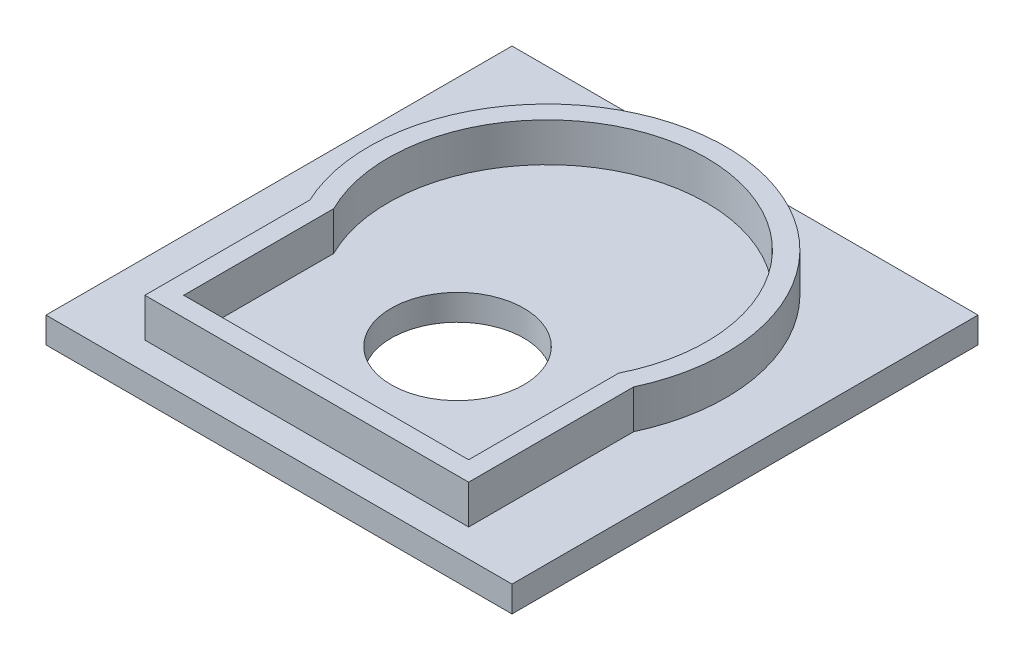
ISO-10303-21;
HEADER;
FILE_DESCRIPTION(('STEP AP214'),'2;1');
FILE_NAME('part.step','',(''),(''),'','','');
FILE_SCHEMA(('AUTOMOTIVE_DESIGN { 1 0 10303 214 1 1 1 1 }'));
ENDSEC;
DATA;
#1=APPLICATION_CONTEXT('core data for automotive mechanical design processes');
#2=APPLICATION_PROTOCOL_DEFINITION('international standard','automotive_design',2000,#1);
#3=PRODUCT_CONTEXT('',#1,'mechanical');
#4=PRODUCT('Part','Part','',(#3));
#5=PRODUCT_RELATED_PRODUCT_CATEGORY('part','',(#4));
#6=PRODUCT_DEFINITION_FORMATION('','',#4);
#7=PRODUCT_DEFINITION_CONTEXT('part definition',#1,'design');
#8=PRODUCT_DEFINITION('design','',#6,#7);
#9=PRODUCT_DEFINITION_SHAPE('','',#8);
#10=(LENGTH_UNIT() NAMED_UNIT(*) SI_UNIT(.MILLI.,.METRE.));
#11=(NAMED_UNIT(*) PLANE_ANGLE_UNIT() SI_UNIT($,.RADIAN.));
#12=(NAMED_UNIT(*) SI_UNIT($,.STERADIAN.) SOLID_ANGLE_UNIT());
#13=UNCERTAINTY_MEASURE_WITH_UNIT(LENGTH_MEASURE(1.E-05),#10,'distance_accuracy_value','');
#14=(GEOMETRIC_REPRESENTATION_CONTEXT(3) GLOBAL_UNCERTAINTY_ASSIGNED_CONTEXT((#13)) GLOBAL_UNIT_ASSIGNED_CONTEXT((#10,
#11,#12)) REPRESENTATION_CONTEXT('',''));
#15=CARTESIAN_POINT('',(0.,0.,0.));
#16=DIRECTION('',(0.,0.,1.));
#17=DIRECTION('',(1.,0.,0.));
#18=AXIS2_PLACEMENT_3D('',#15,#16,#17);
#19=CARTESIAN_POINT('',(0.,8.46666666666667,0.));
#20=DIRECTION('',(0.,1.,0.));
#21=DIRECTION('',(0.,0.,1.));
#22=AXIS2_PLACEMENT_3D('',#19,#20,#21);
#23=PLANE('',#22);
#24=DIRECTION('',(0.,0.,-1.));
#25=VECTOR('',#24,1.);
#26=CARTESIAN_POINT('',(76.2,8.46666666666667,-76.2));
#27=LINE('',#26,#25);
#28=CARTESIAN_POINT('',(76.2,8.46666666666667,76.2));
#29=VERTEX_POINT('',#28);
#30=CARTESIAN_POINT('',(76.2,8.46666666666667,-76.2));
#31=VERTEX_POINT('',#30);
#32=EDGE_CURVE('E247',#29,#31,#27,.T.);
#33=ORIENTED_EDGE('',*,*,#32,.T.);
#34=DIRECTION('',(-1.,0.,0.));
#35=VECTOR('',#34,1.);
#36=CARTESIAN_POINT('',(-76.2,8.46666666666667,-76.2));
#37=LINE('',#36,#35);
#38=CARTESIAN_POINT('',(-76.2,8.46666666666667,-76.2));
#39=VERTEX_POINT('',#38);
#40=EDGE_CURVE('E251',#31,#39,#37,.T.);
#41=ORIENTED_EDGE('',*,*,#40,.T.);
#42=DIRECTION('',(0.,0.,1.));
#43=VECTOR('',#42,1.);
#44=CARTESIAN_POINT('',(-76.2,8.46666666666667,-76.2));
#45=LINE('',#44,#43);
#46=CARTESIAN_POINT('',(-76.2,8.46666666666667,76.2));
#47=VERTEX_POINT('',#46);
#48=EDGE_CURVE('E255',#39,#47,#45,.T.);
#49=ORIENTED_EDGE('',*,*,#48,.T.);
#50=DIRECTION('',(1.,0.,0.));
#51=VECTOR('',#50,1.);
#52=CARTESIAN_POINT('',(-76.2,8.46666666666667,76.2));
#53=LINE('',#52,#51);
#54=EDGE_CURVE('E258',#47,#29,#53,.T.);
#55=ORIENTED_EDGE('',*,*,#54,.T.);
#56=EDGE_LOOP('',(#33,#41,#49,#55));
#57=FACE_BOUND('',#56,.T.);
#58=DIRECTION('',(0.,0.,1.));
#59=VECTOR('',#58,1.);
#60=CARTESIAN_POINT('',(-52.9405989942451,8.46666666666667,13.1599667301579));
#61=LINE('',#60,#59);
#62=CARTESIAN_POINT('',(-52.9405989942451,8.46666666666667,13.1599667301579));
#63=VERTEX_POINT('',#62);
#64=CARTESIAN_POINT('',(-52.9405989942451,8.46666666666667,67.1216409257638));
#65=VERTEX_POINT('',#64);
#66=EDGE_CURVE('E202',#63,#65,#61,.T.);
#67=ORIENTED_EDGE('',*,*,#66,.F.);
#68=CARTESIAN_POINT('',(0.,8.46666666666667,-11.5420448909739));
#69=DIRECTION('',(0.,1.,0.));
#70=DIRECTION('',(0.,0.,1.));
#71=AXIS2_PLACEMENT_3D('',#68,#69,#70);
#72=CIRCLE('',#71,58.42);
#73=CARTESIAN_POINT('',(52.9405989942451,8.46666666666667,13.159966730158));
#74=VERTEX_POINT('',#73);
#75=EDGE_CURVE('E151',#74,#63,#72,.T.);
#76=ORIENTED_EDGE('',*,*,#75,.F.);
#77=DIRECTION('',(0.,0.,-1.));
#78=VECTOR('',#77,1.);
#79=CARTESIAN_POINT('',(52.9405989942451,8.46666666666667,13.159966730158));
#80=LINE('',#79,#78);
#81=CARTESIAN_POINT('',(52.9405989942451,8.46666666666667,67.1216409257638));
#82=VERTEX_POINT('',#81);
#83=EDGE_CURVE('E189',#82,#74,#80,.T.);
#84=ORIENTED_EDGE('',*,*,#83,.F.);
#85=DIRECTION('',(1.,0.,0.));
#86=VECTOR('',#85,1.);
#87=CARTESIAN_POINT('',(-52.9405989942451,8.46666666666667,67.1216409257638));
#88=LINE('',#87,#86);
#89=EDGE_CURVE('E205',#65,#82,#88,.T.);
#90=ORIENTED_EDGE('',*,*,#89,.F.);
#91=EDGE_LOOP('',(#67,#76,#84,#90));
#92=FACE_BOUND('',#91,.T.);
#93=ADVANCED_FACE('F39',(#57,#92),#23,.T.);
#94=CARTESIAN_POINT('',(76.2,8.46666666666667,-76.2));
#95=DIRECTION('',(-1.,0.,0.));
#96=DIRECTION('',(0.,0.,1.));
#97=AXIS2_PLACEMENT_3D('',#94,#95,#96);
#98=PLANE('',#97);
#99=DIRECTION('',(0.,0.,-1.));
#100=VECTOR('',#99,1.);
#101=CARTESIAN_POINT('',(76.2,0.,-76.2));
#102=LINE('',#101,#100);
#103=CARTESIAN_POINT('',(76.2,0.,76.2));
#104=VERTEX_POINT('',#103);
#105=CARTESIAN_POINT('',(76.2,0.,-76.2));
#106=VERTEX_POINT('',#105);
#107=EDGE_CURVE('E227',#104,#106,#102,.T.);
#108=ORIENTED_EDGE('',*,*,#107,.T.);
#109=DIRECTION('',(0.,-1.,0.));
#110=VECTOR('',#109,1.);
#111=CARTESIAN_POINT('',(76.2,8.46666666666667,-76.2));
#112=LINE('',#111,#110);
#113=EDGE_CURVE('E11',#31,#106,#112,.T.);
#114=ORIENTED_EDGE('',*,*,#113,.F.);
#115=ORIENTED_EDGE('',*,*,#32,.F.);
#116=DIRECTION('',(0.,-1.,0.));
#117=VECTOR('',#116,1.);
#118=CARTESIAN_POINT('',(76.2,8.46666666666667,76.2));
#119=LINE('',#118,#117);
#120=EDGE_CURVE('E261',#29,#104,#119,.T.);
#121=ORIENTED_EDGE('',*,*,#120,.T.);
#122=EDGE_LOOP('',(#108,#114,#115,#121));
#123=FACE_BOUND('',#122,.T.);
#124=ADVANCED_FACE('F41',(#123),#98,.F.);
#125=CARTESIAN_POINT('',(-76.2,8.46666666666667,-76.2));
#126=DIRECTION('',(0.,0.,1.));
#127=DIRECTION('',(1.,0.,0.));
#128=AXIS2_PLACEMENT_3D('',#125,#126,#127);
#129=PLANE('',#128);
#130=DIRECTION('',(-1.,0.,0.));
#131=VECTOR('',#130,1.);
#132=CARTESIAN_POINT('',(-76.2,0.,-76.2));
#133=LINE('',#132,#131);
#134=CARTESIAN_POINT('',(-76.2,0.,-76.2));
#135=VERTEX_POINT('',#134);
#136=EDGE_CURVE('E265',#106,#135,#133,.T.);
#137=ORIENTED_EDGE('',*,*,#136,.T.);
#138=DIRECTION('',(0.,-1.,0.));
#139=VECTOR('',#138,1.);
#140=CARTESIAN_POINT('',(-76.2,8.46666666666667,-76.2));
#141=LINE('',#140,#139);
#142=EDGE_CURVE('E49',#39,#135,#141,.T.);
#143=ORIENTED_EDGE('',*,*,#142,.F.);
#144=ORIENTED_EDGE('',*,*,#40,.F.);
#145=ORIENTED_EDGE('',*,*,#113,.T.);
#146=EDGE_LOOP('',(#137,#143,#144,#145));
#147=FACE_BOUND('',#146,.T.);
#148=ADVANCED_FACE('F302',(#147),#129,.F.);
#149=CARTESIAN_POINT('',(-76.2,8.46666666666667,-76.2));
#150=DIRECTION('',(1.,0.,0.));
#151=DIRECTION('',(0.,0.,-1.));
#152=AXIS2_PLACEMENT_3D('',#149,#150,#151);
#153=PLANE('',#152);
#154=DIRECTION('',(0.,0.,1.));
#155=VECTOR('',#154,1.);
#156=CARTESIAN_POINT('',(-76.2,0.,-76.2));
#157=LINE('',#156,#155);
#158=CARTESIAN_POINT('',(-76.2,0.,76.2));
#159=VERTEX_POINT('',#158);
#160=EDGE_CURVE('E268',#135,#159,#157,.T.);
#161=ORIENTED_EDGE('',*,*,#160,.T.);
#162=DIRECTION('',(0.,-1.,0.));
#163=VECTOR('',#162,1.);
#164=CARTESIAN_POINT('',(-76.2,8.46666666666667,76.2));
#165=LINE('',#164,#163);
#166=EDGE_CURVE('E276',#47,#159,#165,.T.);
#167=ORIENTED_EDGE('',*,*,#166,.F.);
#168=ORIENTED_EDGE('',*,*,#48,.F.);
#169=ORIENTED_EDGE('',*,*,#142,.T.);
#170=EDGE_LOOP('',(#161,#167,#168,#169));
#171=FACE_BOUND('',#170,.T.);
#172=ADVANCED_FACE('F286',(#171),#153,.F.);
#173=CARTESIAN_POINT('',(-76.2,8.46666666666667,76.2));
#174=DIRECTION('',(0.,0.,-1.));
#175=DIRECTION('',(-1.,0.,0.));
#176=AXIS2_PLACEMENT_3D('',#173,#174,#175);
#177=PLANE('',#176);
#178=DIRECTION('',(1.,0.,0.));
#179=VECTOR('',#178,1.);
#180=CARTESIAN_POINT('',(-76.2,0.,76.2));
#181=LINE('',#180,#179);
#182=EDGE_CURVE('E252',#159,#104,#181,.T.);
#183=ORIENTED_EDGE('',*,*,#182,.T.);
#184=ORIENTED_EDGE('',*,*,#120,.F.);
#185=ORIENTED_EDGE('',*,*,#54,.F.);
#186=ORIENTED_EDGE('',*,*,#166,.T.);
#187=EDGE_LOOP('',(#183,#184,#185,#186));
#188=FACE_BOUND('',#187,.T.);
#189=ADVANCED_FACE('F295',(#188),#177,.F.);
#190=CARTESIAN_POINT('',(0.,0.,0.));
#191=DIRECTION('',(0.,1.,0.));
#192=DIRECTION('',(0.,0.,1.));
#193=AXIS2_PLACEMENT_3D('',#190,#191,#192);
#194=PLANE('',#193);
#195=CARTESIAN_POINT('',(0.,0.,17.8134930454306));
#196=DIRECTION('',(0.,1.,0.));
#197=DIRECTION('',(0.,0.,1.));
#198=AXIS2_PLACEMENT_3D('',#195,#196,#197);
#199=CIRCLE('',#198,21.6974104951068);
#200=CARTESIAN_POINT('',(0.,0.,39.5109035405374));
#201=VERTEX_POINT('',#200);
#202=EDGE_CURVE('E43',#201,#201,#199,.T.);
#203=ORIENTED_EDGE('',*,*,#202,.T.);
#204=EDGE_LOOP('',(#203));
#205=FACE_BOUND('',#204,.T.);
#206=CARTESIAN_POINT('',(61.7294251388275,0.,-44.45));
#207=DIRECTION('',(0.,-1.,0.));
#208=DIRECTION('',(0.,0.,-1.));
#209=AXIS2_PLACEMENT_3D('',#206,#207,#208);
#210=CIRCLE('',#209,5.08);
#211=CARTESIAN_POINT('',(61.7294251388275,0.,-49.53));
#212=VERTEX_POINT('',#211);
#213=EDGE_CURVE('E228',#212,#212,#210,.T.);
#214=ORIENTED_EDGE('',*,*,#213,.F.);
#215=EDGE_LOOP('',(#214));
#216=FACE_BOUND('',#215,.T.);
#217=CARTESIAN_POINT('',(-61.3459586208379,0.,-44.6732744098641));
#218=DIRECTION('',(0.,-1.,0.));
#219=DIRECTION('',(0.,0.,-1.));
#220=AXIS2_PLACEMENT_3D('',#217,#218,#219);
#221=CIRCLE('',#220,5.08000000000001);
#222=CARTESIAN_POINT('',(-61.3459586208379,0.,-49.7532744098641));
#223=VERTEX_POINT('',#222);
#224=EDGE_CURVE('E232',#223,#223,#221,.T.);
#225=ORIENTED_EDGE('',*,*,#224,.F.);
#226=EDGE_LOOP('',(#225));
#227=FACE_BOUND('',#226,.T.);
#228=CARTESIAN_POINT('',(0.,0.,61.1273418618459));
#229=DIRECTION('',(0.,-1.,0.));
#230=DIRECTION('',(0.,0.,-1.));
#231=AXIS2_PLACEMENT_3D('',#228,#229,#230);
#232=CIRCLE('',#231,5.08);
#233=CARTESIAN_POINT('',(0.,0.,56.0473418618459));
#234=VERTEX_POINT('',#233);
#235=EDGE_CURVE('E240',#234,#234,#232,.T.);
#236=ORIENTED_EDGE('',*,*,#235,.F.);
#237=EDGE_LOOP('',(#236));
#238=FACE_BOUND('',#237,.T.);
#239=ORIENTED_EDGE('',*,*,#107,.F.);
#240=ORIENTED_EDGE('',*,*,#182,.F.);
#241=ORIENTED_EDGE('',*,*,#160,.F.);
#242=ORIENTED_EDGE('',*,*,#136,.F.);
#243=EDGE_LOOP('',(#239,#240,#241,#242));
#244=FACE_BOUND('',#243,.T.);
#245=ADVANCED_FACE('F292',(#205,#216,#227,#238,#244),#194,.F.);
#246=CARTESIAN_POINT('',(0.,6.35,61.1273418618459));
#247=DIRECTION('',(0.,-1.,0.));
#248=DIRECTION('',(0.,0.,-1.));
#249=AXIS2_PLACEMENT_3D('',#246,#247,#248);
#250=CYLINDRICAL_SURFACE('',#249,5.08);
#251=CARTESIAN_POINT('',(0.,6.35,61.1273418618459));
#252=DIRECTION('',(0.,-1.,0.));
#253=DIRECTION('',(0.,0.,-1.));
#254=AXIS2_PLACEMENT_3D('',#251,#252,#253);
#255=CIRCLE('',#254,5.08);
#256=CARTESIAN_POINT('',(0.,6.35,56.0473418618459));
#257=VERTEX_POINT('',#256);
#258=EDGE_CURVE('E222',#257,#257,#255,.T.);
#259=ORIENTED_EDGE('',*,*,#258,.F.);
#260=EDGE_LOOP('',(#259));
#261=FACE_BOUND('',#260,.T.);
#262=ORIENTED_EDGE('',*,*,#235,.T.);
#263=EDGE_LOOP('',(#262));
#264=FACE_BOUND('',#263,.T.);
#265=ADVANCED_FACE('F340',(#261,#264),#250,.F.);
#266=CARTESIAN_POINT('',(0.,6.35,61.1273418618459));
#267=DIRECTION('',(0.,-1.,0.));
#268=DIRECTION('',(0.,0.,-1.));
#269=AXIS2_PLACEMENT_3D('',#266,#267,#268);
#270=PLANE('',#269);
#271=ORIENTED_EDGE('',*,*,#258,.T.);
#272=EDGE_LOOP('',(#271));
#273=FACE_BOUND('',#272,.T.);
#274=ADVANCED_FACE('F348',(#273),#270,.T.);
#275=CARTESIAN_POINT('',(-61.3459586208379,6.35,-44.6732744098641));
#276=DIRECTION('',(0.,-1.,0.));
#277=DIRECTION('',(0.,0.,-1.));
#278=AXIS2_PLACEMENT_3D('',#275,#276,#277);
#279=CYLINDRICAL_SURFACE('',#278,5.08000000000001);
#280=CARTESIAN_POINT('',(-61.3459586208379,6.35,-44.6732744098641));
#281=DIRECTION('',(0.,-1.,0.));
#282=DIRECTION('',(0.,0.,-1.));
#283=AXIS2_PLACEMENT_3D('',#280,#281,#282);
#284=CIRCLE('',#283,5.08000000000001);
#285=CARTESIAN_POINT('',(-61.3459586208379,6.35,-49.7532744098641));
#286=VERTEX_POINT('',#285);
#287=EDGE_CURVE('E236',#286,#286,#284,.T.);
#288=ORIENTED_EDGE('',*,*,#287,.F.);
#289=EDGE_LOOP('',(#288));
#290=FACE_BOUND('',#289,.T.);
#291=ORIENTED_EDGE('',*,*,#224,.T.);
#292=EDGE_LOOP('',(#291));
#293=FACE_BOUND('',#292,.T.);
#294=ADVANCED_FACE('F354',(#290,#293),#279,.F.);
#295=CARTESIAN_POINT('',(-61.3459586208379,6.35,-44.6732744098641));
#296=DIRECTION('',(0.,-1.,0.));
#297=DIRECTION('',(0.,0.,-1.));
#298=AXIS2_PLACEMENT_3D('',#295,#296,#297);
#299=PLANE('',#298);
#300=ORIENTED_EDGE('',*,*,#287,.T.);
#301=EDGE_LOOP('',(#300));
#302=FACE_BOUND('',#301,.T.);
#303=ADVANCED_FACE('F358',(#302),#299,.T.);
#304=CARTESIAN_POINT('',(61.7294251388275,6.35,-44.45));
#305=DIRECTION('',(0.,-1.,0.));
#306=DIRECTION('',(0.,0.,-1.));
#307=AXIS2_PLACEMENT_3D('',#304,#305,#306);
#308=CYLINDRICAL_SURFACE('',#307,5.08);
#309=CARTESIAN_POINT('',(61.7294251388275,6.35,-44.45));
#310=DIRECTION('',(0.,-1.,0.));
#311=DIRECTION('',(0.,0.,-1.));
#312=AXIS2_PLACEMENT_3D('',#309,#310,#311);
#313=CIRCLE('',#312,5.08);
#314=CARTESIAN_POINT('',(61.7294251388275,6.35,-49.53));
#315=VERTEX_POINT('',#314);
#316=EDGE_CURVE('E223',#315,#315,#313,.T.);
#317=ORIENTED_EDGE('',*,*,#316,.F.);
#318=EDGE_LOOP('',(#317));
#319=FACE_BOUND('',#318,.T.);
#320=ORIENTED_EDGE('',*,*,#213,.T.);
#321=EDGE_LOOP('',(#320));
#322=FACE_BOUND('',#321,.T.);
#323=ADVANCED_FACE('F361',(#319,#322),#308,.F.);
#324=CARTESIAN_POINT('',(61.7294251388275,6.35,-44.45));
#325=DIRECTION('',(0.,-1.,0.));
#326=DIRECTION('',(0.,0.,-1.));
#327=AXIS2_PLACEMENT_3D('',#324,#325,#326);
#328=PLANE('',#327);
#329=ORIENTED_EDGE('',*,*,#316,.T.);
#330=EDGE_LOOP('',(#329));
#331=FACE_BOUND('',#330,.T.);
#332=ADVANCED_FACE('F368',(#331),#328,.T.);
#333=CARTESIAN_POINT('',(0.,21.1666666666667,-11.5420448909739));
#334=DIRECTION('',(0.,1.,0.));
#335=DIRECTION('',(0.,0.,1.));
#336=AXIS2_PLACEMENT_3D('',#333,#334,#335);
#337=PLANE('',#336);
#338=CARTESIAN_POINT('',(0.,21.1666666666667,-11.5420448909739));
#339=DIRECTION('',(0.,1.,0.));
#340=DIRECTION('',(0.,0.,1.));
#341=AXIS2_PLACEMENT_3D('',#338,#339,#340);
#342=CIRCLE('',#341,58.42);
#343=CARTESIAN_POINT('',(52.9405989942451,21.1666666666667,13.159966730158));
#344=VERTEX_POINT('',#343);
#345=CARTESIAN_POINT('',(-52.9405989942451,21.1666666666667,13.1599667301579));
#346=VERTEX_POINT('',#345);
#347=EDGE_CURVE('E184',#344,#346,#342,.T.);
#348=ORIENTED_EDGE('',*,*,#347,.T.);
#349=DIRECTION('',(0.,0.,1.));
#350=VECTOR('',#349,1.);
#351=CARTESIAN_POINT('',(-52.9405989942451,21.1666666666667,13.1599667301579));
#352=LINE('',#351,#350);
#353=CARTESIAN_POINT('',(-52.9405989942451,21.1666666666667,67.1216409257638));
#354=VERTEX_POINT('',#353);
#355=EDGE_CURVE('E188',#346,#354,#352,.T.);
#356=ORIENTED_EDGE('',*,*,#355,.T.);
#357=DIRECTION('',(1.,0.,0.));
#358=VECTOR('',#357,1.);
#359=CARTESIAN_POINT('',(-52.9405989942451,21.1666666666667,67.1216409257638));
#360=LINE('',#359,#358);
#361=CARTESIAN_POINT('',(52.9405989942451,21.1666666666667,67.1216409257638));
#362=VERTEX_POINT('',#361);
#363=EDGE_CURVE('E192',#354,#362,#360,.T.);
#364=ORIENTED_EDGE('',*,*,#363,.T.);
#365=DIRECTION('',(0.,0.,-1.));
#366=VECTOR('',#365,1.);
#367=CARTESIAN_POINT('',(52.9405989942451,21.1666666666667,13.159966730158));
#368=LINE('',#367,#366);
#369=EDGE_CURVE('E195',#362,#344,#368,.T.);
#370=ORIENTED_EDGE('',*,*,#369,.T.);
#371=EDGE_LOOP('',(#348,#356,#364,#370));
#372=FACE_BOUND('',#371,.T.);
#373=CARTESIAN_POINT('',(0.,21.1666666666667,-11.5420448909739));
#374=DIRECTION('',(0.,1.,0.));
#375=DIRECTION('',(0.,0.,1.));
#376=AXIS2_PLACEMENT_3D('',#373,#374,#375);
#377=CIRCLE('',#376,52.07);
#378=CARTESIAN_POINT('',(46.5905989942451,21.1666666666667,11.7087827363913));
#379=VERTEX_POINT('',#378);
#380=CARTESIAN_POINT('',(-46.5905989942451,21.1666666666667,11.7087827363912));
#381=VERTEX_POINT('',#380);
#382=EDGE_CURVE('E142',#379,#381,#377,.T.);
#383=ORIENTED_EDGE('',*,*,#382,.F.);
#384=DIRECTION('',(0.,0.,-1.));
#385=VECTOR('',#384,1.);
#386=CARTESIAN_POINT('',(46.5905989942451,21.1666666666667,11.7087827363913));
#387=LINE('',#386,#385);
#388=CARTESIAN_POINT('',(46.5905989942451,21.1666666666667,60.7716409257638));
#389=VERTEX_POINT('',#388);
#390=EDGE_CURVE('E132',#389,#379,#387,.T.);
#391=ORIENTED_EDGE('',*,*,#390,.F.);
#392=DIRECTION('',(1.,0.,0.));
#393=VECTOR('',#392,1.);
#394=CARTESIAN_POINT('',(-46.5905989942451,21.1666666666667,60.7716409257638));
#395=LINE('',#394,#393);
#396=CARTESIAN_POINT('',(-46.5905989942451,21.1666666666667,60.7716409257638));
#397=VERTEX_POINT('',#396);
#398=EDGE_CURVE('E161',#397,#389,#395,.T.);
#399=ORIENTED_EDGE('',*,*,#398,.F.);
#400=DIRECTION('',(0.,0.,1.));
#401=VECTOR('',#400,1.);
#402=CARTESIAN_POINT('',(-46.5905989942451,21.1666666666667,11.7087827363912));
#403=LINE('',#402,#401);
#404=EDGE_CURVE('E157',#381,#397,#403,.T.);
#405=ORIENTED_EDGE('',*,*,#404,.F.);
#406=EDGE_LOOP('',(#383,#391,#399,#405));
#407=FACE_BOUND('',#406,.T.);
#408=ADVANCED_FACE('F155',(#372,#407),#337,.T.);
#409=CARTESIAN_POINT('',(0.,21.1666666666667,-11.5420448909739));
#410=DIRECTION('',(0.,-1.,0.));
#411=DIRECTION('',(0.,0.,-1.));
#412=AXIS2_PLACEMENT_3D('',#409,#410,#411);
#413=CYLINDRICAL_SURFACE('',#412,58.42);
#414=ORIENTED_EDGE('',*,*,#75,.T.);
#415=DIRECTION('',(0.,-1.,0.));
#416=VECTOR('',#415,1.);
#417=CARTESIAN_POINT('',(-52.9405989942451,21.1666666666667,13.1599667301579));
#418=LINE('',#417,#416);
#419=EDGE_CURVE('E219',#346,#63,#418,.T.);
#420=ORIENTED_EDGE('',*,*,#419,.F.);
#421=ORIENTED_EDGE('',*,*,#347,.F.);
#422=DIRECTION('',(0.,-1.,0.));
#423=VECTOR('',#422,1.);
#424=CARTESIAN_POINT('',(52.9405989942451,21.1666666666667,13.159966730158));
#425=LINE('',#424,#423);
#426=EDGE_CURVE('E198',#344,#74,#425,.T.);
#427=ORIENTED_EDGE('',*,*,#426,.T.);
#428=EDGE_LOOP('',(#414,#420,#421,#427));
#429=FACE_BOUND('',#428,.T.);
#430=ADVANCED_FACE('F373',(#429),#413,.T.);
#431=CARTESIAN_POINT('',(-52.9405989942451,21.1666666666667,13.1599667301579));
#432=DIRECTION('',(1.,0.,0.));
#433=DIRECTION('',(0.,0.,-1.));
#434=AXIS2_PLACEMENT_3D('',#431,#432,#433);
#435=PLANE('',#434);
#436=ORIENTED_EDGE('',*,*,#66,.T.);
#437=DIRECTION('',(0.,-1.,0.));
#438=VECTOR('',#437,1.);
#439=CARTESIAN_POINT('',(-52.9405989942451,21.1666666666667,67.1216409257638));
#440=LINE('',#439,#438);
#441=EDGE_CURVE('E215',#354,#65,#440,.T.);
#442=ORIENTED_EDGE('',*,*,#441,.F.);
#443=ORIENTED_EDGE('',*,*,#355,.F.);
#444=ORIENTED_EDGE('',*,*,#419,.T.);
#445=EDGE_LOOP('',(#436,#442,#443,#444));
#446=FACE_BOUND('',#445,.T.);
#447=ADVANCED_FACE('F376',(#446),#435,.F.);
#448=CARTESIAN_POINT('',(-52.9405989942451,21.1666666666667,67.1216409257638));
#449=DIRECTION('',(0.,0.,-1.));
#450=DIRECTION('',(-1.,0.,0.));
#451=AXIS2_PLACEMENT_3D('',#448,#449,#450);
#452=PLANE('',#451);
#453=ORIENTED_EDGE('',*,*,#89,.T.);
#454=DIRECTION('',(0.,-1.,0.));
#455=VECTOR('',#454,1.);
#456=CARTESIAN_POINT('',(52.9405989942451,21.1666666666667,67.1216409257638));
#457=LINE('',#456,#455);
#458=EDGE_CURVE('E56',#362,#82,#457,.T.);
#459=ORIENTED_EDGE('',*,*,#458,.F.);
#460=ORIENTED_EDGE('',*,*,#363,.F.);
#461=ORIENTED_EDGE('',*,*,#441,.T.);
#462=EDGE_LOOP('',(#453,#459,#460,#461));
#463=FACE_BOUND('',#462,.T.);
#464=ADVANCED_FACE('F380',(#463),#452,.F.);
#465=CARTESIAN_POINT('',(52.9405989942451,21.1666666666667,13.159966730158));
#466=DIRECTION('',(-1.,0.,0.));
#467=DIRECTION('',(0.,0.,1.));
#468=AXIS2_PLACEMENT_3D('',#465,#466,#467);
#469=PLANE('',#468);
#470=ORIENTED_EDGE('',*,*,#83,.T.);
#471=ORIENTED_EDGE('',*,*,#426,.F.);
#472=ORIENTED_EDGE('',*,*,#369,.F.);
#473=ORIENTED_EDGE('',*,*,#458,.T.);
#474=EDGE_LOOP('',(#470,#471,#472,#473));
#475=FACE_BOUND('',#474,.T.);
#476=ADVANCED_FACE('F384',(#475),#469,.F.);
#477=CARTESIAN_POINT('',(46.5905989942451,21.1666666666667,11.7087827363913));
#478=DIRECTION('',(-1.,0.,0.));
#479=DIRECTION('',(0.,0.,1.));
#480=AXIS2_PLACEMENT_3D('',#477,#478,#479);
#481=PLANE('',#480);
#482=DIRECTION('',(0.,0.,-1.));
#483=VECTOR('',#482,1.);
#484=CARTESIAN_POINT('',(46.5905989942451,8.46666666666667,11.7087827363913));
#485=LINE('',#484,#483);
#486=CARTESIAN_POINT('',(46.5905989942451,8.46666666666667,60.7716409257638));
#487=VERTEX_POINT('',#486);
#488=CARTESIAN_POINT('',(46.5905989942451,8.46666666666667,11.7087827363913));
#489=VERTEX_POINT('',#488);
#490=EDGE_CURVE('E64',#487,#489,#485,.T.);
#491=ORIENTED_EDGE('',*,*,#490,.F.);
#492=DIRECTION('',(0.,-1.,0.));
#493=VECTOR('',#492,1.);
#494=CARTESIAN_POINT('',(46.5905989942451,21.1666666666667,60.7716409257638));
#495=LINE('',#494,#493);
#496=EDGE_CURVE('E137',#389,#487,#495,.T.);
#497=ORIENTED_EDGE('',*,*,#496,.F.);
#498=ORIENTED_EDGE('',*,*,#390,.T.);
#499=DIRECTION('',(0.,-1.,0.));
#500=VECTOR('',#499,1.);
#501=CARTESIAN_POINT('',(46.5905989942451,21.1666666666667,11.7087827363913));
#502=LINE('',#501,#500);
#503=EDGE_CURVE('E135',#379,#489,#502,.T.);
#504=ORIENTED_EDGE('',*,*,#503,.T.);
#505=EDGE_LOOP('',(#491,#497,#498,#504));
#506=FACE_BOUND('',#505,.T.);
#507=ADVANCED_FACE('F134',(#506),#481,.T.);
#508=CARTESIAN_POINT('',(0.,21.1666666666667,-11.5420448909739));
#509=DIRECTION('',(0.,-1.,0.));
#510=DIRECTION('',(0.,0.,-1.));
#511=AXIS2_PLACEMENT_3D('',#508,#509,#510);
#512=CYLINDRICAL_SURFACE('',#511,52.07);
#513=CARTESIAN_POINT('',(0.,8.46666666666667,-11.5420448909739));
#514=DIRECTION('',(0.,1.,0.));
#515=DIRECTION('',(0.,0.,1.));
#516=AXIS2_PLACEMENT_3D('',#513,#514,#515);
#517=CIRCLE('',#516,52.07);
#518=CARTESIAN_POINT('',(-46.5905989942451,8.46666666666667,11.7087827363912));
#519=VERTEX_POINT('',#518);
#520=EDGE_CURVE('E149',#489,#519,#517,.T.);
#521=ORIENTED_EDGE('',*,*,#520,.F.);
#522=ORIENTED_EDGE('',*,*,#503,.F.);
#523=ORIENTED_EDGE('',*,*,#382,.T.);
#524=DIRECTION('',(0.,-1.,0.));
#525=VECTOR('',#524,1.);
#526=CARTESIAN_POINT('',(-46.5905989942451,21.1666666666667,11.7087827363912));
#527=LINE('',#526,#525);
#528=EDGE_CURVE('E152',#381,#519,#527,.T.);
#529=ORIENTED_EDGE('',*,*,#528,.T.);
#530=EDGE_LOOP('',(#521,#522,#523,#529));
#531=FACE_BOUND('',#530,.T.);
#532=ADVANCED_FACE('F146',(#531),#512,.F.);
#533=CARTESIAN_POINT('',(-46.5905989942451,21.1666666666667,11.7087827363912));
#534=DIRECTION('',(1.,0.,0.));
#535=DIRECTION('',(0.,0.,-1.));
#536=AXIS2_PLACEMENT_3D('',#533,#534,#535);
#537=PLANE('',#536);
#538=DIRECTION('',(0.,0.,1.));
#539=VECTOR('',#538,1.);
#540=CARTESIAN_POINT('',(-46.5905989942451,8.46666666666667,11.7087827363912));
#541=LINE('',#540,#539);
#542=CARTESIAN_POINT('',(-46.5905989942451,8.46666666666667,60.7716409257638));
#543=VERTEX_POINT('',#542);
#544=EDGE_CURVE('E171',#519,#543,#541,.T.);
#545=ORIENTED_EDGE('',*,*,#544,.F.);
#546=ORIENTED_EDGE('',*,*,#528,.F.);
#547=ORIENTED_EDGE('',*,*,#404,.T.);
#548=DIRECTION('',(0.,-1.,0.));
#549=VECTOR('',#548,1.);
#550=CARTESIAN_POINT('',(-46.5905989942451,21.1666666666667,60.7716409257638));
#551=LINE('',#550,#549);
#552=EDGE_CURVE('E178',#397,#543,#551,.T.);
#553=ORIENTED_EDGE('',*,*,#552,.T.);
#554=EDGE_LOOP('',(#545,#546,#547,#553));
#555=FACE_BOUND('',#554,.T.);
#556=ADVANCED_FACE('F326',(#555),#537,.T.);
#557=CARTESIAN_POINT('',(-46.5905989942451,21.1666666666667,60.7716409257638));
#558=DIRECTION('',(0.,0.,-1.));
#559=DIRECTION('',(-1.,0.,0.));
#560=AXIS2_PLACEMENT_3D('',#557,#558,#559);
#561=PLANE('',#560);
#562=DIRECTION('',(1.,0.,0.));
#563=VECTOR('',#562,1.);
#564=CARTESIAN_POINT('',(-46.5905989942451,8.46666666666667,60.7716409257638));
#565=LINE('',#564,#563);
#566=EDGE_CURVE('E143',#543,#487,#565,.T.);
#567=ORIENTED_EDGE('',*,*,#566,.F.);
#568=ORIENTED_EDGE('',*,*,#552,.F.);
#569=ORIENTED_EDGE('',*,*,#398,.T.);
#570=ORIENTED_EDGE('',*,*,#496,.T.);
#571=EDGE_LOOP('',(#567,#568,#569,#570));
#572=FACE_BOUND('',#571,.T.);
#573=ADVANCED_FACE('F318',(#572),#561,.T.);
#574=CARTESIAN_POINT('',(0.,8.46666666666667,17.8134930454306));
#575=DIRECTION('',(0.,1.,0.));
#576=DIRECTION('',(0.,0.,1.));
#577=AXIS2_PLACEMENT_3D('',#574,#575,#576);
#578=CIRCLE('',#577,21.6974104951068);
#579=CARTESIAN_POINT('',(0.,8.46666666666667,39.5109035405374));
#580=VERTEX_POINT('',#579);
#581=EDGE_CURVE('E331',#580,#580,#578,.T.);
#582=ORIENTED_EDGE('',*,*,#581,.F.);
#583=EDGE_LOOP('',(#582));
#584=FACE_BOUND('',#583,.T.);
#585=ORIENTED_EDGE('',*,*,#490,.T.);
#586=ORIENTED_EDGE('',*,*,#520,.T.);
#587=ORIENTED_EDGE('',*,*,#544,.T.);
#588=ORIENTED_EDGE('',*,*,#566,.T.);
#589=EDGE_LOOP('',(#585,#586,#587,#588));
#590=FACE_BOUND('',#589,.T.);
#591=ADVANCED_FACE('F311',(#584,#590),#23,.T.);
#592=CARTESIAN_POINT('',(0.,-4.23333333333333,17.8134930454306));
#593=DIRECTION('',(0.,1.,0.));
#594=DIRECTION('',(0.,0.,1.));
#595=AXIS2_PLACEMENT_3D('',#592,#593,#594);
#596=CYLINDRICAL_SURFACE('',#595,21.6974104951068);
#597=ORIENTED_EDGE('',*,*,#581,.T.);
#598=EDGE_LOOP('',(#597));
#599=FACE_BOUND('',#598,.T.);
#600=ORIENTED_EDGE('',*,*,#202,.F.);
#601=EDGE_LOOP('',(#600));
#602=FACE_BOUND('',#601,.T.);
#603=ADVANCED_FACE('F317',(#599,#602),#596,.F.);
#604=CLOSED_SHELL('',(#93,#124,#148,#172,#189,#245,#265,#274,#294,#303,#323,#332,#408,#430,#447,
#464,#476,#507,#532,#556,#573,#591,#603));
#605=MANIFOLD_SOLID_BREP('B2',#604);
#606=ADVANCED_BREP_SHAPE_REPRESENTATION('',(#18,#605),#14);
#607=SHAPE_DEFINITION_REPRESENTATION(#9,#606);
ENDSEC;
END-ISO-10303-21;
